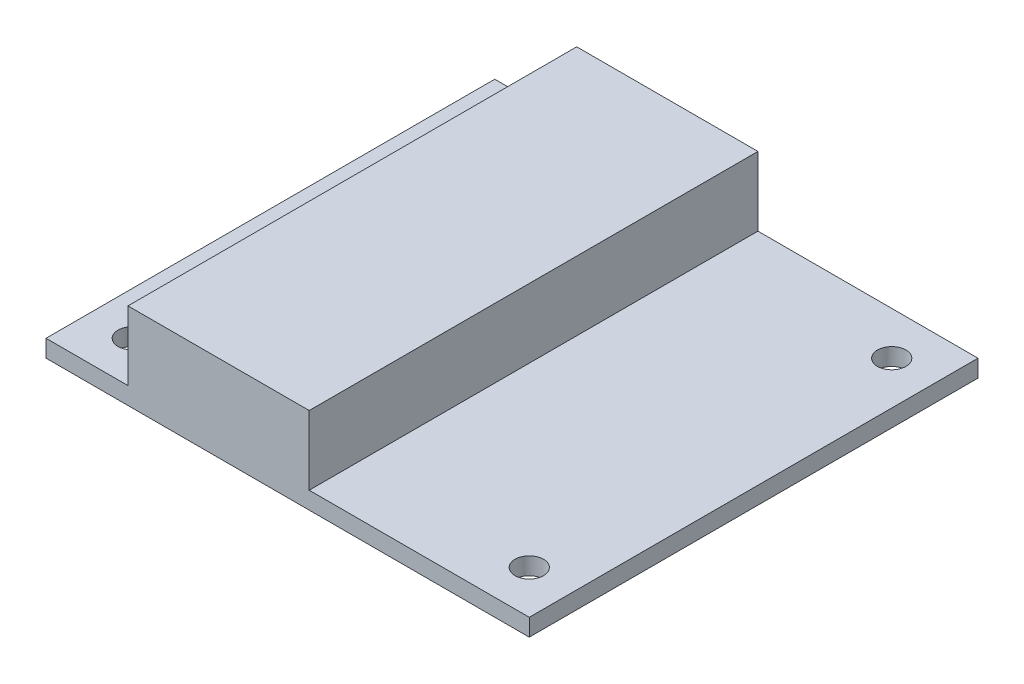
ISO-10303-21;
HEADER;
FILE_DESCRIPTION(('STEP AP214'),'2;1');
FILE_NAME('part.step','',(''),(''),'','','');
FILE_SCHEMA(('AUTOMOTIVE_DESIGN { 1 0 10303 214 1 1 1 1 }'));
ENDSEC;
DATA;
#1=APPLICATION_CONTEXT('core data for automotive mechanical design processes');
#2=APPLICATION_PROTOCOL_DEFINITION('international standard','automotive_design',2000,#1);
#3=PRODUCT_CONTEXT('',#1,'mechanical');
#4=PRODUCT('Part','Part','',(#3));
#5=PRODUCT_RELATED_PRODUCT_CATEGORY('part','',(#4));
#6=PRODUCT_DEFINITION_FORMATION('','',#4);
#7=PRODUCT_DEFINITION_CONTEXT('part definition',#1,'design');
#8=PRODUCT_DEFINITION('design','',#6,#7);
#9=PRODUCT_DEFINITION_SHAPE('','',#8);
#10=(LENGTH_UNIT() NAMED_UNIT(*) SI_UNIT(.MILLI.,.METRE.));
#11=(NAMED_UNIT(*) PLANE_ANGLE_UNIT() SI_UNIT($,.RADIAN.));
#12=(NAMED_UNIT(*) SI_UNIT($,.STERADIAN.) SOLID_ANGLE_UNIT());
#13=UNCERTAINTY_MEASURE_WITH_UNIT(LENGTH_MEASURE(1.E-05),#10,'distance_accuracy_value','');
#14=(GEOMETRIC_REPRESENTATION_CONTEXT(3) GLOBAL_UNCERTAINTY_ASSIGNED_CONTEXT((#13)) GLOBAL_UNIT_ASSIGNED_CONTEXT((#10,
#11,#12)) REPRESENTATION_CONTEXT('',''));
#15=CARTESIAN_POINT('',(0.,0.,0.));
#16=DIRECTION('',(0.,0.,1.));
#17=DIRECTION('',(1.,0.,0.));
#18=AXIS2_PLACEMENT_3D('',#15,#16,#17);
#19=CARTESIAN_POINT('',(0.,2.,0.));
#20=DIRECTION('',(0.,-1.,0.));
#21=DIRECTION('',(0.,0.,-1.));
#22=AXIS2_PLACEMENT_3D('',#19,#20,#21);
#23=PLANE('',#22);
#24=CARTESIAN_POINT('',(5.,2.,-47.));
#25=DIRECTION('',(0.,1.,0.));
#26=DIRECTION('',(0.,0.,1.));
#27=AXIS2_PLACEMENT_3D('',#24,#25,#26);
#28=CIRCLE('',#27,1.65);
#29=CARTESIAN_POINT('',(5.,2.,-45.35));
#30=VERTEX_POINT('',#29);
#31=EDGE_CURVE('E144',#30,#30,#28,.T.);
#32=ORIENTED_EDGE('',*,*,#31,.F.);
#33=EDGE_LOOP('',(#32));
#34=FACE_BOUND('',#33,.T.);
#35=CARTESIAN_POINT('',(5.,2.,-5.));
#36=DIRECTION('',(0.,1.,0.));
#37=DIRECTION('',(0.,0.,1.));
#38=AXIS2_PLACEMENT_3D('',#35,#36,#37);
#39=CIRCLE('',#38,1.65);
#40=CARTESIAN_POINT('',(5.,2.,-3.35));
#41=VERTEX_POINT('',#40);
#42=EDGE_CURVE('E148',#41,#41,#39,.T.);
#43=ORIENTED_EDGE('',*,*,#42,.F.);
#44=EDGE_LOOP('',(#43));
#45=FACE_BOUND('',#44,.T.);
#46=DIRECTION('',(0.,0.,1.));
#47=VECTOR('',#46,1.);
#48=CARTESIAN_POINT('',(9.5,2.,-52.));
#49=LINE('',#48,#47);
#50=CARTESIAN_POINT('',(9.50000000000001,2.,-52.));
#51=VERTEX_POINT('',#50);
#52=CARTESIAN_POINT('',(9.50000000000001,2.,0.));
#53=VERTEX_POINT('',#52);
#54=EDGE_CURVE('E58',#51,#53,#49,.T.);
#55=ORIENTED_EDGE('',*,*,#54,.F.);
#56=DIRECTION('',(-1.,0.,0.));
#57=VECTOR('',#56,1.);
#58=CARTESIAN_POINT('',(0.,2.,-52.));
#59=LINE('',#58,#57);
#60=CARTESIAN_POINT('',(0.,2.,-52.));
#61=VERTEX_POINT('',#60);
#62=EDGE_CURVE('E168',#51,#61,#59,.T.);
#63=ORIENTED_EDGE('',*,*,#62,.T.);
#64=DIRECTION('',(0.,0.,1.));
#65=VECTOR('',#64,1.);
#66=CARTESIAN_POINT('',(0.,2.,0.));
#67=LINE('',#66,#65);
#68=CARTESIAN_POINT('',(0.,2.,0.));
#69=VERTEX_POINT('',#68);
#70=EDGE_CURVE('E159',#61,#69,#67,.T.);
#71=ORIENTED_EDGE('',*,*,#70,.T.);
#72=DIRECTION('',(1.,0.,0.));
#73=VECTOR('',#72,1.);
#74=CARTESIAN_POINT('',(0.,2.,0.));
#75=LINE('',#74,#73);
#76=EDGE_CURVE('E164',#69,#53,#75,.T.);
#77=ORIENTED_EDGE('',*,*,#76,.T.);
#78=EDGE_LOOP('',(#55,#63,#71,#77));
#79=FACE_BOUND('',#78,.T.);
#80=ADVANCED_FACE('F43',(#34,#45,#79),#23,.F.);
#81=CARTESIAN_POINT('',(51.,2.,-5.));
#82=DIRECTION('',(0.,1.,0.));
#83=DIRECTION('',(0.,0.,1.));
#84=AXIS2_PLACEMENT_3D('',#81,#82,#83);
#85=CIRCLE('',#84,1.65);
#86=CARTESIAN_POINT('',(51.,2.,-3.35));
#87=VERTEX_POINT('',#86);
#88=EDGE_CURVE('E132',#87,#87,#85,.T.);
#89=ORIENTED_EDGE('',*,*,#88,.F.);
#90=EDGE_LOOP('',(#89));
#91=FACE_BOUND('',#90,.T.);
#92=CARTESIAN_POINT('',(51.,2.,-47.));
#93=DIRECTION('',(0.,1.,0.));
#94=DIRECTION('',(0.,0.,1.));
#95=AXIS2_PLACEMENT_3D('',#92,#93,#94);
#96=CIRCLE('',#95,1.65);
#97=CARTESIAN_POINT('',(51.,2.,-45.35));
#98=VERTEX_POINT('',#97);
#99=EDGE_CURVE('E141',#98,#98,#96,.T.);
#100=ORIENTED_EDGE('',*,*,#99,.F.);
#101=EDGE_LOOP('',(#100));
#102=FACE_BOUND('',#101,.T.);
#103=DIRECTION('',(0.,0.,-1.));
#104=VECTOR('',#103,1.);
#105=CARTESIAN_POINT('',(30.5,2.,-52.));
#106=LINE('',#105,#104);
#107=CARTESIAN_POINT('',(30.5,2.,0.));
#108=VERTEX_POINT('',#107);
#109=CARTESIAN_POINT('',(30.5,2.,-52.));
#110=VERTEX_POINT('',#109);
#111=EDGE_CURVE('E66',#108,#110,#106,.T.);
#112=ORIENTED_EDGE('',*,*,#111,.F.);
#113=CARTESIAN_POINT('',(56.,2.,0.));
#114=VERTEX_POINT('',#113);
#115=EDGE_CURVE('E162',#108,#114,#75,.T.);
#116=ORIENTED_EDGE('',*,*,#115,.T.);
#117=DIRECTION('',(0.,0.,-1.));
#118=VECTOR('',#117,1.);
#119=CARTESIAN_POINT('',(56.,2.,0.));
#120=LINE('',#119,#118);
#121=CARTESIAN_POINT('',(56.,2.,-52.));
#122=VERTEX_POINT('',#121);
#123=EDGE_CURVE('E166',#114,#122,#120,.T.);
#124=ORIENTED_EDGE('',*,*,#123,.T.);
#125=EDGE_CURVE('E169',#122,#110,#59,.T.);
#126=ORIENTED_EDGE('',*,*,#125,.T.);
#127=EDGE_LOOP('',(#112,#116,#124,#126));
#128=FACE_BOUND('',#127,.T.);
#129=ADVANCED_FACE('F211',(#91,#102,#128),#23,.F.);
#130=CARTESIAN_POINT('',(0.,2.,0.));
#131=DIRECTION('',(1.,0.,0.));
#132=DIRECTION('',(0.,0.,-1.));
#133=AXIS2_PLACEMENT_3D('',#130,#131,#132);
#134=PLANE('',#133);
#135=DIRECTION('',(0.,0.,1.));
#136=VECTOR('',#135,1.);
#137=CARTESIAN_POINT('',(0.,0.,0.));
#138=LINE('',#137,#136);
#139=CARTESIAN_POINT('',(0.,0.,-52.));
#140=VERTEX_POINT('',#139);
#141=CARTESIAN_POINT('',(0.,0.,0.));
#142=VERTEX_POINT('',#141);
#143=EDGE_CURVE('E156',#140,#142,#138,.T.);
#144=ORIENTED_EDGE('',*,*,#143,.T.);
#145=DIRECTION('',(0.,-1.,0.));
#146=VECTOR('',#145,1.);
#147=CARTESIAN_POINT('',(0.,2.,0.));
#148=LINE('',#147,#146);
#149=EDGE_CURVE('E11',#69,#142,#148,.T.);
#150=ORIENTED_EDGE('',*,*,#149,.F.);
#151=ORIENTED_EDGE('',*,*,#70,.F.);
#152=DIRECTION('',(0.,-1.,0.));
#153=VECTOR('',#152,1.);
#154=CARTESIAN_POINT('',(0.,2.,-52.));
#155=LINE('',#154,#153);
#156=EDGE_CURVE('E171',#61,#140,#155,.T.);
#157=ORIENTED_EDGE('',*,*,#156,.T.);
#158=EDGE_LOOP('',(#144,#150,#151,#157));
#159=FACE_BOUND('',#158,.T.);
#160=ADVANCED_FACE('F45',(#159),#134,.F.);
#161=CARTESIAN_POINT('',(0.,2.,0.));
#162=DIRECTION('',(0.,0.,-1.));
#163=DIRECTION('',(-1.,0.,0.));
#164=AXIS2_PLACEMENT_3D('',#161,#162,#163);
#165=PLANE('',#164);
#166=DIRECTION('',(1.,0.,0.));
#167=VECTOR('',#166,1.);
#168=CARTESIAN_POINT('',(0.,0.,0.));
#169=LINE('',#168,#167);
#170=CARTESIAN_POINT('',(56.,0.,0.));
#171=VERTEX_POINT('',#170);
#172=EDGE_CURVE('E174',#142,#171,#169,.T.);
#173=ORIENTED_EDGE('',*,*,#172,.T.);
#174=DIRECTION('',(0.,-1.,0.));
#175=VECTOR('',#174,1.);
#176=CARTESIAN_POINT('',(56.,2.,0.));
#177=LINE('',#176,#175);
#178=EDGE_CURVE('E51',#114,#171,#177,.T.);
#179=ORIENTED_EDGE('',*,*,#178,.F.);
#180=ORIENTED_EDGE('',*,*,#115,.F.);
#181=DIRECTION('',(0.,-1.,0.));
#182=VECTOR('',#181,1.);
#183=CARTESIAN_POINT('',(30.5,10.,0.));
#184=LINE('',#183,#182);
#185=CARTESIAN_POINT('',(30.5,10.,0.));
#186=VERTEX_POINT('',#185);
#187=EDGE_CURVE('E114',#186,#108,#184,.T.);
#188=ORIENTED_EDGE('',*,*,#187,.F.);
#189=DIRECTION('',(1.,0.,0.));
#190=VECTOR('',#189,1.);
#191=CARTESIAN_POINT('',(9.50000000000001,10.,0.));
#192=LINE('',#191,#190);
#193=CARTESIAN_POINT('',(9.50000000000001,10.,0.));
#194=VERTEX_POINT('',#193);
#195=EDGE_CURVE('E108',#194,#186,#192,.T.);
#196=ORIENTED_EDGE('',*,*,#195,.F.);
#197=DIRECTION('',(0.,-1.,0.));
#198=VECTOR('',#197,1.);
#199=CARTESIAN_POINT('',(9.50000000000001,10.,0.));
#200=LINE('',#199,#198);
#201=EDGE_CURVE('E112',#194,#53,#200,.T.);
#202=ORIENTED_EDGE('',*,*,#201,.T.);
#203=ORIENTED_EDGE('',*,*,#76,.F.);
#204=ORIENTED_EDGE('',*,*,#149,.T.);
#205=EDGE_LOOP('',(#173,#179,#180,#188,#196,#202,#203,#204));
#206=FACE_BOUND('',#205,.T.);
#207=ADVANCED_FACE('F110',(#206),#165,.F.);
#208=CARTESIAN_POINT('',(56.,2.,0.));
#209=DIRECTION('',(-1.,0.,0.));
#210=DIRECTION('',(0.,0.,1.));
#211=AXIS2_PLACEMENT_3D('',#208,#209,#210);
#212=PLANE('',#211);
#213=DIRECTION('',(0.,0.,-1.));
#214=VECTOR('',#213,1.);
#215=CARTESIAN_POINT('',(56.,0.,0.));
#216=LINE('',#215,#214);
#217=CARTESIAN_POINT('',(56.,0.,-52.));
#218=VERTEX_POINT('',#217);
#219=EDGE_CURVE('E176',#171,#218,#216,.T.);
#220=ORIENTED_EDGE('',*,*,#219,.T.);
#221=DIRECTION('',(0.,-1.,0.));
#222=VECTOR('',#221,1.);
#223=CARTESIAN_POINT('',(56.,2.,-52.));
#224=LINE('',#223,#222);
#225=EDGE_CURVE('E181',#122,#218,#224,.T.);
#226=ORIENTED_EDGE('',*,*,#225,.F.);
#227=ORIENTED_EDGE('',*,*,#123,.F.);
#228=ORIENTED_EDGE('',*,*,#178,.T.);
#229=EDGE_LOOP('',(#220,#226,#227,#228));
#230=FACE_BOUND('',#229,.T.);
#231=ADVANCED_FACE('F188',(#230),#212,.F.);
#232=CARTESIAN_POINT('',(0.,2.,-52.));
#233=DIRECTION('',(0.,0.,1.));
#234=DIRECTION('',(1.,0.,0.));
#235=AXIS2_PLACEMENT_3D('',#232,#233,#234);
#236=PLANE('',#235);
#237=DIRECTION('',(-1.,0.,0.));
#238=VECTOR('',#237,1.);
#239=CARTESIAN_POINT('',(0.,0.,-52.));
#240=LINE('',#239,#238);
#241=EDGE_CURVE('E163',#218,#140,#240,.T.);
#242=ORIENTED_EDGE('',*,*,#241,.T.);
#243=ORIENTED_EDGE('',*,*,#156,.F.);
#244=ORIENTED_EDGE('',*,*,#62,.F.);
#245=DIRECTION('',(0.,-1.,0.));
#246=VECTOR('',#245,1.);
#247=CARTESIAN_POINT('',(9.5,10.,-52.));
#248=LINE('',#247,#246);
#249=CARTESIAN_POINT('',(9.5,10.,-52.));
#250=VERTEX_POINT('',#249);
#251=EDGE_CURVE('E201',#250,#51,#248,.T.);
#252=ORIENTED_EDGE('',*,*,#251,.F.);
#253=DIRECTION('',(-1.,0.,0.));
#254=VECTOR('',#253,1.);
#255=CARTESIAN_POINT('',(9.5,10.,-52.));
#256=LINE('',#255,#254);
#257=CARTESIAN_POINT('',(30.5,10.,-52.));
#258=VERTEX_POINT('',#257);
#259=EDGE_CURVE('E123',#258,#250,#256,.T.);
#260=ORIENTED_EDGE('',*,*,#259,.F.);
#261=DIRECTION('',(0.,-1.,0.));
#262=VECTOR('',#261,1.);
#263=CARTESIAN_POINT('',(30.5,10.,-52.));
#264=LINE('',#263,#262);
#265=EDGE_CURVE('E134',#258,#110,#264,.T.);
#266=ORIENTED_EDGE('',*,*,#265,.T.);
#267=ORIENTED_EDGE('',*,*,#125,.F.);
#268=ORIENTED_EDGE('',*,*,#225,.T.);
#269=EDGE_LOOP('',(#242,#243,#244,#252,#260,#266,#267,#268));
#270=FACE_BOUND('',#269,.T.);
#271=ADVANCED_FACE('F196',(#270),#236,.F.);
#272=CARTESIAN_POINT('',(0.,0.,0.));
#273=DIRECTION('',(0.,-1.,0.));
#274=DIRECTION('',(0.,0.,-1.));
#275=AXIS2_PLACEMENT_3D('',#272,#273,#274);
#276=PLANE('',#275);
#277=CARTESIAN_POINT('',(51.,0.,-47.));
#278=DIRECTION('',(0.,1.,0.));
#279=DIRECTION('',(0.,0.,1.));
#280=AXIS2_PLACEMENT_3D('',#277,#278,#279);
#281=CIRCLE('',#280,1.65);
#282=CARTESIAN_POINT('',(51.,0.,-45.35));
#283=VERTEX_POINT('',#282);
#284=EDGE_CURVE('E145',#283,#283,#281,.T.);
#285=ORIENTED_EDGE('',*,*,#284,.T.);
#286=EDGE_LOOP('',(#285));
#287=FACE_BOUND('',#286,.T.);
#288=CARTESIAN_POINT('',(5.,0.,-5.));
#289=DIRECTION('',(0.,1.,0.));
#290=DIRECTION('',(0.,0.,1.));
#291=AXIS2_PLACEMENT_3D('',#288,#289,#290);
#292=CIRCLE('',#291,1.65);
#293=CARTESIAN_POINT('',(5.,0.,-3.35));
#294=VERTEX_POINT('',#293);
#295=EDGE_CURVE('E139',#294,#294,#292,.T.);
#296=ORIENTED_EDGE('',*,*,#295,.T.);
#297=EDGE_LOOP('',(#296));
#298=FACE_BOUND('',#297,.T.);
#299=CARTESIAN_POINT('',(51.,0.,-5.));
#300=DIRECTION('',(0.,1.,0.));
#301=DIRECTION('',(0.,0.,1.));
#302=AXIS2_PLACEMENT_3D('',#299,#300,#301);
#303=CIRCLE('',#302,1.65);
#304=CARTESIAN_POINT('',(51.,0.,-3.35));
#305=VERTEX_POINT('',#304);
#306=EDGE_CURVE('E129',#305,#305,#303,.T.);
#307=ORIENTED_EDGE('',*,*,#306,.T.);
#308=EDGE_LOOP('',(#307));
#309=FACE_BOUND('',#308,.T.);
#310=CARTESIAN_POINT('',(5.,0.,-47.));
#311=DIRECTION('',(0.,1.,0.));
#312=DIRECTION('',(0.,0.,1.));
#313=AXIS2_PLACEMENT_3D('',#310,#311,#312);
#314=CIRCLE('',#313,1.65);
#315=CARTESIAN_POINT('',(5.,0.,-45.35));
#316=VERTEX_POINT('',#315);
#317=EDGE_CURVE('E153',#316,#316,#314,.T.);
#318=ORIENTED_EDGE('',*,*,#317,.T.);
#319=EDGE_LOOP('',(#318));
#320=FACE_BOUND('',#319,.T.);
#321=ORIENTED_EDGE('',*,*,#143,.F.);
#322=ORIENTED_EDGE('',*,*,#241,.F.);
#323=ORIENTED_EDGE('',*,*,#219,.F.);
#324=ORIENTED_EDGE('',*,*,#172,.F.);
#325=EDGE_LOOP('',(#321,#322,#323,#324));
#326=FACE_BOUND('',#325,.T.);
#327=ADVANCED_FACE('F193',(#287,#298,#309,#320,#326),#276,.T.);
#328=CARTESIAN_POINT('',(5.,0.,-47.));
#329=DIRECTION('',(0.,1.,0.));
#330=DIRECTION('',(0.,0.,1.));
#331=AXIS2_PLACEMENT_3D('',#328,#329,#330);
#332=CYLINDRICAL_SURFACE('',#331,1.65);
#333=ORIENTED_EDGE('',*,*,#317,.F.);
#334=EDGE_LOOP('',(#333));
#335=FACE_BOUND('',#334,.T.);
#336=ORIENTED_EDGE('',*,*,#31,.T.);
#337=EDGE_LOOP('',(#336));
#338=FACE_BOUND('',#337,.T.);
#339=ADVANCED_FACE('F225',(#335,#338),#332,.F.);
#340=CARTESIAN_POINT('',(51.,0.,-5.));
#341=DIRECTION('',(0.,1.,0.));
#342=DIRECTION('',(0.,0.,1.));
#343=AXIS2_PLACEMENT_3D('',#340,#341,#342);
#344=CYLINDRICAL_SURFACE('',#343,1.65);
#345=ORIENTED_EDGE('',*,*,#306,.F.);
#346=EDGE_LOOP('',(#345));
#347=FACE_BOUND('',#346,.T.);
#348=ORIENTED_EDGE('',*,*,#88,.T.);
#349=EDGE_LOOP('',(#348));
#350=FACE_BOUND('',#349,.T.);
#351=ADVANCED_FACE('F292',(#347,#350),#344,.F.);
#352=CARTESIAN_POINT('',(5.,0.,-5.));
#353=DIRECTION('',(0.,1.,0.));
#354=DIRECTION('',(0.,0.,1.));
#355=AXIS2_PLACEMENT_3D('',#352,#353,#354);
#356=CYLINDRICAL_SURFACE('',#355,1.65);
#357=ORIENTED_EDGE('',*,*,#295,.F.);
#358=EDGE_LOOP('',(#357));
#359=FACE_BOUND('',#358,.T.);
#360=ORIENTED_EDGE('',*,*,#42,.T.);
#361=EDGE_LOOP('',(#360));
#362=FACE_BOUND('',#361,.T.);
#363=ADVANCED_FACE('F283',(#359,#362),#356,.F.);
#364=CARTESIAN_POINT('',(51.,0.,-47.));
#365=DIRECTION('',(0.,1.,0.));
#366=DIRECTION('',(0.,0.,1.));
#367=AXIS2_PLACEMENT_3D('',#364,#365,#366);
#368=CYLINDRICAL_SURFACE('',#367,1.65);
#369=ORIENTED_EDGE('',*,*,#284,.F.);
#370=EDGE_LOOP('',(#369));
#371=FACE_BOUND('',#370,.T.);
#372=ORIENTED_EDGE('',*,*,#99,.T.);
#373=EDGE_LOOP('',(#372));
#374=FACE_BOUND('',#373,.T.);
#375=ADVANCED_FACE('F248',(#371,#374),#368,.F.);
#376=CARTESIAN_POINT('',(9.5,10.,-52.));
#377=DIRECTION('',(1.,0.,0.));
#378=DIRECTION('',(0.,0.,-1.));
#379=AXIS2_PLACEMENT_3D('',#376,#377,#378);
#380=PLANE('',#379);
#381=ORIENTED_EDGE('',*,*,#54,.T.);
#382=ORIENTED_EDGE('',*,*,#201,.F.);
#383=DIRECTION('',(0.,0.,1.));
#384=VECTOR('',#383,1.);
#385=CARTESIAN_POINT('',(9.5,10.,-52.));
#386=LINE('',#385,#384);
#387=EDGE_CURVE('E118',#250,#194,#386,.T.);
#388=ORIENTED_EDGE('',*,*,#387,.F.);
#389=ORIENTED_EDGE('',*,*,#251,.T.);
#390=EDGE_LOOP('',(#381,#382,#388,#389));
#391=FACE_BOUND('',#390,.T.);
#392=ADVANCED_FACE('F128',(#391),#380,.F.);
#393=CARTESIAN_POINT('',(30.5,10.,-52.));
#394=DIRECTION('',(-1.,0.,0.));
#395=DIRECTION('',(0.,0.,1.));
#396=AXIS2_PLACEMENT_3D('',#393,#394,#395);
#397=PLANE('',#396);
#398=ORIENTED_EDGE('',*,*,#111,.T.);
#399=ORIENTED_EDGE('',*,*,#265,.F.);
#400=DIRECTION('',(0.,0.,-1.));
#401=VECTOR('',#400,1.);
#402=CARTESIAN_POINT('',(30.5,10.,-52.));
#403=LINE('',#402,#401);
#404=EDGE_CURVE('E117',#186,#258,#403,.T.);
#405=ORIENTED_EDGE('',*,*,#404,.F.);
#406=ORIENTED_EDGE('',*,*,#187,.T.);
#407=EDGE_LOOP('',(#398,#399,#405,#406));
#408=FACE_BOUND('',#407,.T.);
#409=ADVANCED_FACE('F210',(#408),#397,.F.);
#410=CARTESIAN_POINT('',(0.,10.,0.));
#411=DIRECTION('',(0.,1.,0.));
#412=DIRECTION('',(0.,0.,1.));
#413=AXIS2_PLACEMENT_3D('',#410,#411,#412);
#414=PLANE('',#413);
#415=ORIENTED_EDGE('',*,*,#387,.T.);
#416=ORIENTED_EDGE('',*,*,#195,.T.);
#417=ORIENTED_EDGE('',*,*,#404,.T.);
#418=ORIENTED_EDGE('',*,*,#259,.T.);
#419=EDGE_LOOP('',(#415,#416,#417,#418));
#420=FACE_BOUND('',#419,.T.);
#421=ADVANCED_FACE('F121',(#420),#414,.T.);
#422=CLOSED_SHELL('',(#80,#129,#160,#207,#231,#271,#327,#339,#351,#363,#375,#392,#409,#421));
#423=MANIFOLD_SOLID_BREP('B2',#422);
#424=ADVANCED_BREP_SHAPE_REPRESENTATION('',(#18,#423),#14);
#425=SHAPE_DEFINITION_REPRESENTATION(#9,#424);
ENDSEC;
END-ISO-10303-21;
